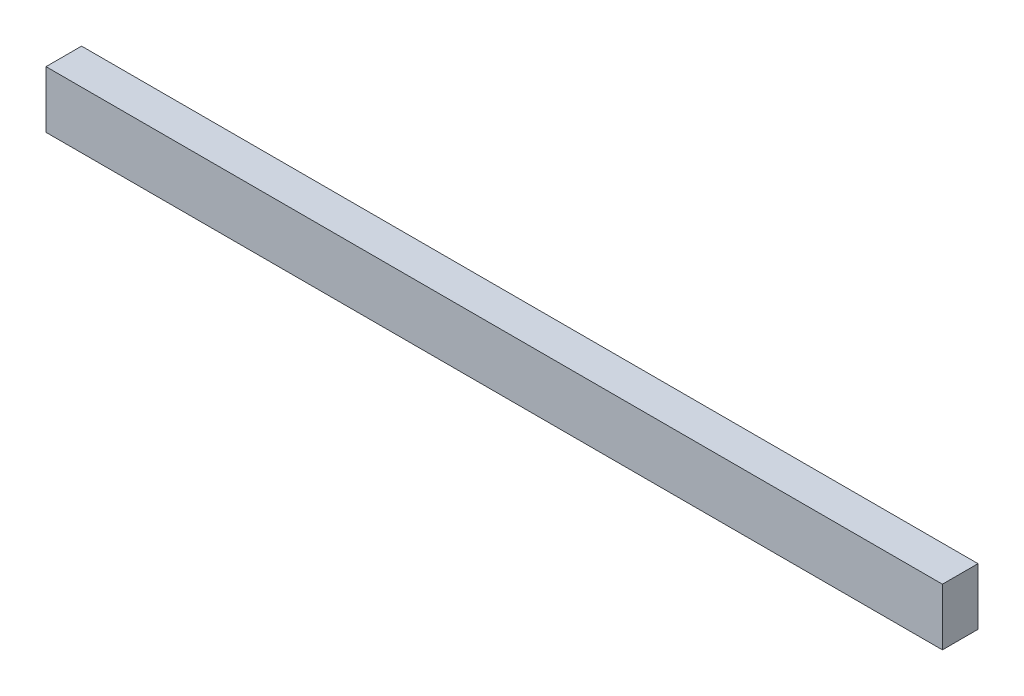
ISO-10303-21;
HEADER;
FILE_DESCRIPTION(('STEP AP214'),'2;1');
FILE_NAME('part.step','',(''),(''),'','','');
FILE_SCHEMA(('AUTOMOTIVE_DESIGN { 1 0 10303 214 1 1 1 1 }'));
ENDSEC;
DATA;
#1=APPLICATION_CONTEXT('core data for automotive mechanical design processes');
#2=APPLICATION_PROTOCOL_DEFINITION('international standard','automotive_design',2000,#1);
#3=PRODUCT_CONTEXT('',#1,'mechanical');
#4=PRODUCT('Part','Part','',(#3));
#5=PRODUCT_RELATED_PRODUCT_CATEGORY('part','',(#4));
#6=PRODUCT_DEFINITION_FORMATION('','',#4);
#7=PRODUCT_DEFINITION_CONTEXT('part definition',#1,'design');
#8=PRODUCT_DEFINITION('design','',#6,#7);
#9=PRODUCT_DEFINITION_SHAPE('','',#8);
#10=(LENGTH_UNIT() NAMED_UNIT(*) SI_UNIT(.MILLI.,.METRE.));
#11=(NAMED_UNIT(*) PLANE_ANGLE_UNIT() SI_UNIT($,.RADIAN.));
#12=(NAMED_UNIT(*) SI_UNIT($,.STERADIAN.) SOLID_ANGLE_UNIT());
#13=UNCERTAINTY_MEASURE_WITH_UNIT(LENGTH_MEASURE(1.E-05),#10,'distance_accuracy_value','');
#14=(GEOMETRIC_REPRESENTATION_CONTEXT(3) GLOBAL_UNCERTAINTY_ASSIGNED_CONTEXT((#13)) GLOBAL_UNIT_ASSIGNED_CONTEXT((#10,
#11,#12)) REPRESENTATION_CONTEXT('',''));
#15=CARTESIAN_POINT('',(0.,0.,0.));
#16=DIRECTION('',(0.,0.,1.));
#17=DIRECTION('',(1.,0.,0.));
#18=AXIS2_PLACEMENT_3D('',#15,#16,#17);
#19=CARTESIAN_POINT('',(700.,1620.,-752.));
#20=DIRECTION('',(-1.,0.,0.));
#21=DIRECTION('',(0.,0.,1.));
#22=AXIS2_PLACEMENT_3D('',#19,#20,#21);
#23=PLANE('',#22);
#24=DIRECTION('',(0.,-1.,0.));
#25=VECTOR('',#24,1.);
#26=CARTESIAN_POINT('',(700.,1620.,-727.));
#27=LINE('',#26,#25);
#28=CARTESIAN_POINT('',(700.,1660.,-727.));
#29=VERTEX_POINT('',#28);
#30=CARTESIAN_POINT('',(700.,1620.,-727.));
#31=VERTEX_POINT('',#30);
#32=EDGE_CURVE('E103',#29,#31,#27,.T.);
#33=ORIENTED_EDGE('',*,*,#32,.F.);
#34=DIRECTION('',(0.,0.,1.));
#35=VECTOR('',#34,1.);
#36=CARTESIAN_POINT('',(700.,1660.,-752.));
#37=LINE('',#36,#35);
#38=CARTESIAN_POINT('',(700.,1660.,-752.));
#39=VERTEX_POINT('',#38);
#40=EDGE_CURVE('E11',#39,#29,#37,.T.);
#41=ORIENTED_EDGE('',*,*,#40,.F.);
#42=DIRECTION('',(0.,-1.,0.));
#43=VECTOR('',#42,1.);
#44=CARTESIAN_POINT('',(700.,1620.,-752.));
#45=LINE('',#44,#43);
#46=CARTESIAN_POINT('',(700.,1620.,-752.));
#47=VERTEX_POINT('',#46);
#48=EDGE_CURVE('E97',#39,#47,#45,.T.);
#49=ORIENTED_EDGE('',*,*,#48,.T.);
#50=DIRECTION('',(0.,0.,1.));
#51=VECTOR('',#50,1.);
#52=CARTESIAN_POINT('',(700.,1620.,-752.));
#53=LINE('',#52,#51);
#54=EDGE_CURVE('E42',#47,#31,#53,.T.);
#55=ORIENTED_EDGE('',*,*,#54,.T.);
#56=EDGE_LOOP('',(#33,#41,#49,#55));
#57=FACE_BOUND('',#56,.T.);
#58=ADVANCED_FACE('F39',(#57),#23,.T.);
#59=CARTESIAN_POINT('',(700.,1660.,-752.));
#60=DIRECTION('',(0.,1.,0.));
#61=DIRECTION('',(0.,0.,1.));
#62=AXIS2_PLACEMENT_3D('',#59,#60,#61);
#63=PLANE('',#62);
#64=DIRECTION('',(-1.,0.,0.));
#65=VECTOR('',#64,1.);
#66=CARTESIAN_POINT('',(700.,1660.,-727.));
#67=LINE('',#66,#65);
#68=CARTESIAN_POINT('',(1330.,1660.,-727.));
#69=VERTEX_POINT('',#68);
#70=EDGE_CURVE('E99',#69,#29,#67,.T.);
#71=ORIENTED_EDGE('',*,*,#70,.F.);
#72=DIRECTION('',(0.,0.,1.));
#73=VECTOR('',#72,1.);
#74=CARTESIAN_POINT('',(1330.,1660.,-752.));
#75=LINE('',#74,#73);
#76=CARTESIAN_POINT('',(1330.,1660.,-752.));
#77=VERTEX_POINT('',#76);
#78=EDGE_CURVE('E48',#77,#69,#75,.T.);
#79=ORIENTED_EDGE('',*,*,#78,.F.);
#80=DIRECTION('',(-1.,0.,0.));
#81=VECTOR('',#80,1.);
#82=CARTESIAN_POINT('',(700.,1660.,-752.));
#83=LINE('',#82,#81);
#84=EDGE_CURVE('E94',#77,#39,#83,.T.);
#85=ORIENTED_EDGE('',*,*,#84,.T.);
#86=ORIENTED_EDGE('',*,*,#40,.T.);
#87=EDGE_LOOP('',(#71,#79,#85,#86));
#88=FACE_BOUND('',#87,.T.);
#89=ADVANCED_FACE('F113',(#88),#63,.T.);
#90=CARTESIAN_POINT('',(1330.,1620.,-752.));
#91=DIRECTION('',(1.,0.,0.));
#92=DIRECTION('',(0.,0.,-1.));
#93=AXIS2_PLACEMENT_3D('',#90,#91,#92);
#94=PLANE('',#93);
#95=DIRECTION('',(0.,1.,0.));
#96=VECTOR('',#95,1.);
#97=CARTESIAN_POINT('',(1330.,1620.,-727.));
#98=LINE('',#97,#96);
#99=CARTESIAN_POINT('',(1330.,1620.,-727.));
#100=VERTEX_POINT('',#99);
#101=EDGE_CURVE('E89',#100,#69,#98,.T.);
#102=ORIENTED_EDGE('',*,*,#101,.F.);
#103=DIRECTION('',(0.,0.,1.));
#104=VECTOR('',#103,1.);
#105=CARTESIAN_POINT('',(1330.,1620.,-752.));
#106=LINE('',#105,#104);
#107=CARTESIAN_POINT('',(1330.,1620.,-752.));
#108=VERTEX_POINT('',#107);
#109=EDGE_CURVE('E84',#108,#100,#106,.T.);
#110=ORIENTED_EDGE('',*,*,#109,.F.);
#111=DIRECTION('',(0.,1.,0.));
#112=VECTOR('',#111,1.);
#113=CARTESIAN_POINT('',(1330.,1620.,-752.));
#114=LINE('',#113,#112);
#115=EDGE_CURVE('E87',#108,#77,#114,.T.);
#116=ORIENTED_EDGE('',*,*,#115,.T.);
#117=ORIENTED_EDGE('',*,*,#78,.T.);
#118=EDGE_LOOP('',(#102,#110,#116,#117));
#119=FACE_BOUND('',#118,.T.);
#120=ADVANCED_FACE('F86',(#119),#94,.T.);
#121=CARTESIAN_POINT('',(700.,1620.,-752.));
#122=DIRECTION('',(0.,-1.,0.));
#123=DIRECTION('',(0.,0.,-1.));
#124=AXIS2_PLACEMENT_3D('',#121,#122,#123);
#125=PLANE('',#124);
#126=DIRECTION('',(1.,0.,0.));
#127=VECTOR('',#126,1.);
#128=CARTESIAN_POINT('',(700.,1620.,-727.));
#129=LINE('',#128,#127);
#130=EDGE_CURVE('E106',#31,#100,#129,.T.);
#131=ORIENTED_EDGE('',*,*,#130,.F.);
#132=ORIENTED_EDGE('',*,*,#54,.F.);
#133=DIRECTION('',(1.,0.,0.));
#134=VECTOR('',#133,1.);
#135=CARTESIAN_POINT('',(700.,1620.,-752.));
#136=LINE('',#135,#134);
#137=EDGE_CURVE('E93',#47,#108,#136,.T.);
#138=ORIENTED_EDGE('',*,*,#137,.T.);
#139=ORIENTED_EDGE('',*,*,#109,.T.);
#140=EDGE_LOOP('',(#131,#132,#138,#139));
#141=FACE_BOUND('',#140,.T.);
#142=ADVANCED_FACE('F96',(#141),#125,.T.);
#143=CARTESIAN_POINT('',(0.,0.,-752.));
#144=DIRECTION('',(0.,0.,-1.));
#145=DIRECTION('',(-1.,0.,0.));
#146=AXIS2_PLACEMENT_3D('',#143,#144,#145);
#147=PLANE('',#146);
#148=ORIENTED_EDGE('',*,*,#48,.F.);
#149=ORIENTED_EDGE('',*,*,#84,.F.);
#150=ORIENTED_EDGE('',*,*,#115,.F.);
#151=ORIENTED_EDGE('',*,*,#137,.F.);
#152=EDGE_LOOP('',(#148,#149,#150,#151));
#153=FACE_BOUND('',#152,.T.);
#154=ADVANCED_FACE('F92',(#153),#147,.T.);
#155=CARTESIAN_POINT('',(0.,0.,-727.));
#156=DIRECTION('',(0.,0.,-1.));
#157=DIRECTION('',(-1.,0.,0.));
#158=AXIS2_PLACEMENT_3D('',#155,#156,#157);
#159=PLANE('',#158);
#160=ORIENTED_EDGE('',*,*,#32,.T.);
#161=ORIENTED_EDGE('',*,*,#130,.T.);
#162=ORIENTED_EDGE('',*,*,#101,.T.);
#163=ORIENTED_EDGE('',*,*,#70,.T.);
#164=EDGE_LOOP('',(#160,#161,#162,#163));
#165=FACE_BOUND('',#164,.T.);
#166=ADVANCED_FACE('F112',(#165),#159,.F.);
#167=CLOSED_SHELL('',(#58,#89,#120,#142,#154,#166));
#168=MANIFOLD_SOLID_BREP('B2',#167);
#169=ADVANCED_BREP_SHAPE_REPRESENTATION('',(#18,#168),#14);
#170=SHAPE_DEFINITION_REPRESENTATION(#9,#169);
ENDSEC;
END-ISO-10303-21;
